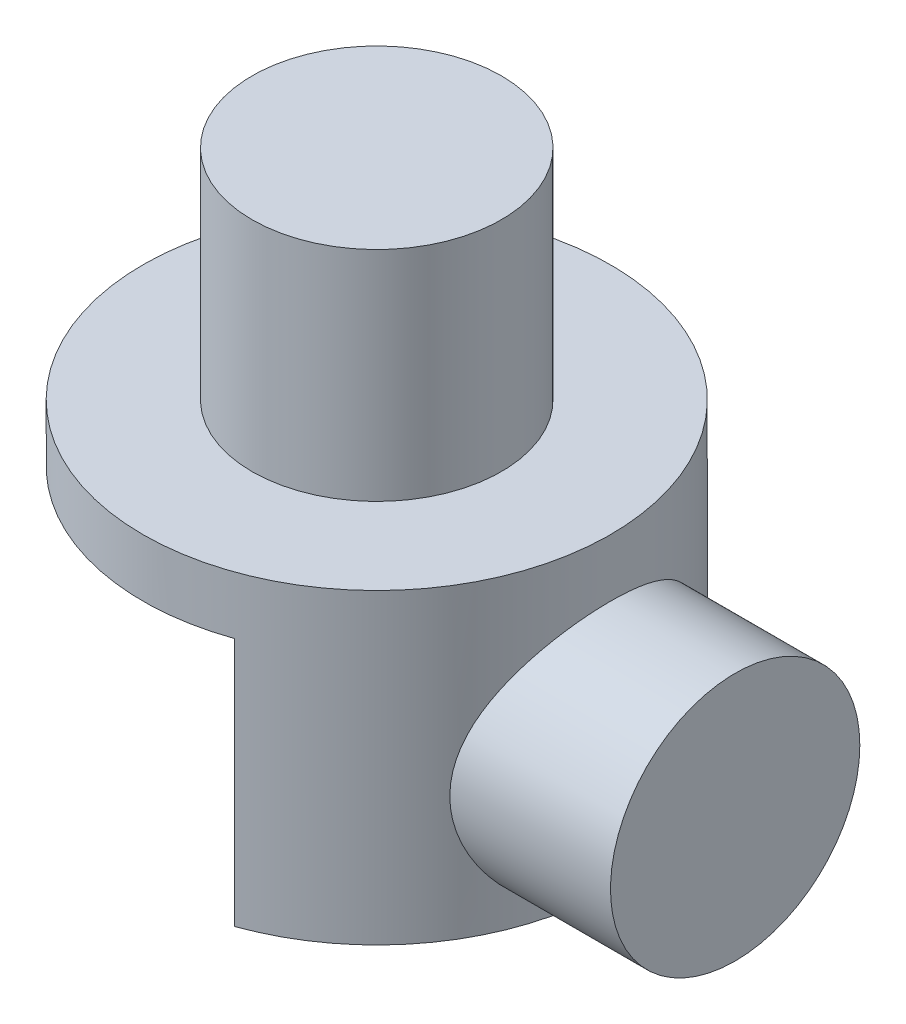
ISO-10303-21;
HEADER;
FILE_DESCRIPTION(('STEP AP214'),'2;1');
FILE_NAME('part.step','',(''),(''),'','','');
FILE_SCHEMA(('AUTOMOTIVE_DESIGN { 1 0 10303 214 1 1 1 1 }'));
ENDSEC;
DATA;
#1=APPLICATION_CONTEXT('core data for automotive mechanical design processes');
#2=APPLICATION_PROTOCOL_DEFINITION('international standard','automotive_design',2000,#1);
#3=PRODUCT_CONTEXT('',#1,'mechanical');
#4=PRODUCT('Part','Part','',(#3));
#5=PRODUCT_RELATED_PRODUCT_CATEGORY('part','',(#4));
#6=PRODUCT_DEFINITION_FORMATION('','',#4);
#7=PRODUCT_DEFINITION_CONTEXT('part definition',#1,'design');
#8=PRODUCT_DEFINITION('design','',#6,#7);
#9=PRODUCT_DEFINITION_SHAPE('','',#8);
#10=(LENGTH_UNIT() NAMED_UNIT(*) SI_UNIT(.MILLI.,.METRE.));
#11=(NAMED_UNIT(*) PLANE_ANGLE_UNIT() SI_UNIT($,.RADIAN.));
#12=(NAMED_UNIT(*) SI_UNIT($,.STERADIAN.) SOLID_ANGLE_UNIT());
#13=UNCERTAINTY_MEASURE_WITH_UNIT(LENGTH_MEASURE(1.E-05),#10,'distance_accuracy_value','');
#14=(GEOMETRIC_REPRESENTATION_CONTEXT(3) GLOBAL_UNCERTAINTY_ASSIGNED_CONTEXT((#13)) GLOBAL_UNIT_ASSIGNED_CONTEXT((#10,
#11,#12)) REPRESENTATION_CONTEXT('',''));
#15=CARTESIAN_POINT('',(0.,0.,0.));
#16=DIRECTION('',(0.,0.,1.));
#17=DIRECTION('',(1.,0.,0.));
#18=AXIS2_PLACEMENT_3D('',#15,#16,#17);
#19=CARTESIAN_POINT('',(0.,1.85,0.));
#20=DIRECTION('',(0.,-1.,0.));
#21=DIRECTION('',(0.,0.,-1.));
#22=AXIS2_PLACEMENT_3D('',#19,#20,#21);
#23=CYLINDRICAL_SURFACE('',#22,7.5);
#24=CARTESIAN_POINT('',(0.,1.85,0.));
#25=DIRECTION('',(0.,1.,0.));
#26=DIRECTION('',(0.,0.,1.));
#27=AXIS2_PLACEMENT_3D('',#24,#25,#26);
#28=CIRCLE('',#27,7.5);
#29=CARTESIAN_POINT('',(0.,1.85,7.5));
#30=VERTEX_POINT('',#29);
#31=EDGE_CURVE('E55',#30,#30,#28,.T.);
#32=ORIENTED_EDGE('',*,*,#31,.F.);
#33=EDGE_LOOP('',(#32));
#34=FACE_BOUND('',#33,.T.);
#35=CARTESIAN_POINT('',(0.,-8.,0.));
#36=DIRECTION('',(0.,-1.,0.));
#37=DIRECTION('',(0.,0.,1.));
#38=AXIS2_PLACEMENT_3D('',#35,#36,#37);
#39=CIRCLE('',#38,7.5);
#40=CARTESIAN_POINT('',(7.5,-8.,0.));
#41=VERTEX_POINT('',#40);
#42=CARTESIAN_POINT('',(2.5,-8.,7.07106781186548));
#43=VERTEX_POINT('',#42);
#44=EDGE_CURVE('E79',#41,#43,#39,.T.);
#45=ORIENTED_EDGE('',*,*,#44,.F.);
#46=CARTESIAN_POINT('',(6.34428877022476,-4.,4.));
#47=CARTESIAN_POINT('',(6.34428830362426,-3.89685951872148,4.00000036116636));
#48=CARTESIAN_POINT('',(6.34681238212198,-3.79372350453203,3.99600566671391));
#49=CARTESIAN_POINT('',(6.35680645313978,-3.58827042299068,3.98008789445433));
#50=CARTESIAN_POINT('',(6.36427830575549,-3.4859536782868,3.96816183487534));
#51=CARTESIAN_POINT('',(6.38389222030966,-3.28284699805151,3.93652969843417));
#52=CARTESIAN_POINT('',(6.39604041069842,-3.18205924722045,3.91681341139617));
#53=CARTESIAN_POINT('',(6.42455191828165,-2.9828419323026,3.86986831662271));
#54=CARTESIAN_POINT('',(6.44091710055245,-2.88441343276474,3.84263618442603));
#55=CARTESIAN_POINT('',(6.49528574194397,-2.59485891509227,3.75051454042651));
#56=CARTESIAN_POINT('',(6.5387143493523,-2.408025203624,3.67496986448624));
#57=CARTESIAN_POINT('',(6.63499735625147,-2.04984547172326,3.49812708733381));
#58=CARTESIAN_POINT('',(6.68785328350142,-1.87850196837275,3.39682481079913));
#59=CARTESIAN_POINT('',(6.80312517186403,-1.5381904906397,3.16012884998962));
#60=CARTESIAN_POINT('',(6.86597249499653,-1.37098070338328,3.02241665379624));
#61=CARTESIAN_POINT('',(6.99070595872307,-1.06057806244482,2.72148987282557));
#62=CARTESIAN_POINT('',(7.05259154158691,-0.917398705029578,2.55826105581742));
#63=CARTESIAN_POINT('',(7.1426455092021,-0.718041721719041,2.28965803204294));
#64=CARTESIAN_POINT('',(7.17323616741983,-0.652125892452859,2.1921806827501));
#65=CARTESIAN_POINT('',(7.23160286993109,-0.528828156182322,1.99119263621684));
#66=CARTESIAN_POINT('',(7.2593801268176,-0.471442567562584,1.88768456881552));
#67=CARTESIAN_POINT('',(7.31132412928514,-0.365777070144316,1.67526048930677));
#68=CARTESIAN_POINT('',(7.3354911070001,-0.317496575853515,1.56634482549775));
#69=CARTESIAN_POINT('',(7.37947845424356,-0.230635927573173,1.34392506317859));
#70=CARTESIAN_POINT('',(7.39930140012975,-0.192050021918153,1.2304237319053));
#71=CARTESIAN_POINT('',(7.43262328863746,-0.127715914303937,1.00879348258243));
#72=CARTESIAN_POINT('',(7.44649710047808,-0.101196485373028,0.900944542404754));
#73=CARTESIAN_POINT('',(7.46964064976823,-0.0571732387668518,0.682985576818887));
#74=CARTESIAN_POINT('',(7.47891273499633,-0.0396648235470625,0.572876734325223));
#75=CARTESIAN_POINT('',(7.49258884597767,-0.0138982654344577,0.351320443482026));
#76=CARTESIAN_POINT('',(7.49699462428509,-0.00563679232904127,0.239873491666579));
#77=CARTESIAN_POINT('',(7.50081261479417,0.00152460923567981,0.0165987671156426));
#78=CARTESIAN_POINT('',(7.50022519020419,0.000425218609371757,-0.0952289773292834));
#79=CARTESIAN_POINT('',(7.49437902818909,-0.0105468757448968,-0.307221674685573));
#80=CARTESIAN_POINT('',(7.48958821645741,-0.0195407940112967,-0.40744585813265));
#81=CARTESIAN_POINT('',(7.47609058444024,-0.0449981628660848,-0.606683346511145));
#82=CARTESIAN_POINT('',(7.46738251868692,-0.0614639891182039,-0.705696256032612));
#83=CARTESIAN_POINT('',(7.43566388753626,-0.121814044548408,-0.999812619515286));
#84=CARTESIAN_POINT('',(7.40705283232187,-0.17666156951274,-1.1921926813063));
#85=CARTESIAN_POINT('',(7.33703480697238,-0.314136065870602,-1.56677227675135));
#86=CARTESIAN_POINT('',(7.29547849592566,-0.397088295730491,-1.74882205139958));
#87=CARTESIAN_POINT('',(7.20317443640815,-0.587860966652318,-2.09683305038025));
#88=CARTESIAN_POINT('',(7.15242360495951,-0.695689752298495,-2.26278884956334));
#89=CARTESIAN_POINT('',(7.04014494842088,-0.945920271906222,-2.59223860409952));
#90=CARTESIAN_POINT('',(6.97804534234028,-1.09074602715711,-2.75369756251597));
#91=CARTESIAN_POINT('',(6.85319448303079,-1.40442017474105,-3.05119735766159));
#92=CARTESIAN_POINT('',(6.79044266923494,-1.57329114877496,-3.18721401963542));
#93=CARTESIAN_POINT('',(6.6658002716699,-1.94668312694474,-3.44073017105825));
#94=CARTESIAN_POINT('',(6.60437206928146,-2.15296880129814,-3.55590786815166));
#95=CARTESIAN_POINT('',(6.52360492320023,-2.47736189406762,-3.70076234562952));
#96=CARTESIAN_POINT('',(6.49857494178283,-2.58800815202909,-3.74440046743027));
#97=CARTESIAN_POINT('',(6.45332075092818,-2.81360733731007,-3.82186664196563));
#98=CARTESIAN_POINT('',(6.43309338587968,-2.9285573789703,-3.85570113951701));
#99=CARTESIAN_POINT('',(6.39977370683186,-3.15244200425189,-3.91073492926686));
#100=CARTESIAN_POINT('',(6.38623776881821,-3.26111486054406,-3.93273271256195));
#101=CARTESIAN_POINT('',(6.36459759042033,-3.48039304208916,-3.96765953407161));
#102=CARTESIAN_POINT('',(6.3564903185014,-3.59099725334404,-3.98059363391483));
#103=CARTESIAN_POINT('',(6.34607201023125,-3.81310869542557,-3.99718238972551));
#104=CARTESIAN_POINT('',(6.3437576116751,-3.92461536473833,-4.00084242840728));
#105=CARTESIAN_POINT('',(6.34502488319353,-4.14750391699368,-3.99883249058122));
#106=CARTESIAN_POINT('',(6.34860600613062,-4.2588858105562,-3.99316337987084));
#107=CARTESIAN_POINT('',(6.36063535771052,-4.46570424420917,-3.97396833938438));
#108=CARTESIAN_POINT('',(6.3683727655776,-4.56129093107725,-3.96158788758346));
#109=CARTESIAN_POINT('',(6.3878781302586,-4.75093501203188,-3.93005725662692));
#110=CARTESIAN_POINT('',(6.39964739083981,-4.84499190111437,-3.91090488759367));
#111=CARTESIAN_POINT('',(6.44046230133925,-5.1239552145897,-3.84359837630776));
#112=CARTESIAN_POINT('',(6.47502296219509,-5.30577685355066,-3.78558312282822));
#113=CARTESIAN_POINT('',(6.55667740487937,-5.66496121960721,-3.64239055541202));
#114=CARTESIAN_POINT('',(6.60425843359295,-5.84176990951326,-3.55612415468074));
#115=CARTESIAN_POINT('',(6.70628228186569,-6.17948538586243,-3.35976377508047));
#116=CARTESIAN_POINT('',(6.76072858645555,-6.3403840213198,-3.24965767392532));
#117=CARTESIAN_POINT('',(6.87995159117055,-6.66647114366188,-2.98991165583786));
#118=CARTESIAN_POINT('',(6.94506930981437,-6.82880566376881,-2.83683827022625));
#119=CARTESIAN_POINT('',(7.07159638356237,-7.12660507948739,-2.50479844607497));
#120=CARTESIAN_POINT('',(7.13300388785642,-7.26205664048507,-2.32581923333881));
#121=CARTESIAN_POINT('',(7.21889091401179,-7.44461965909848,-2.03675011028394));
#122=CARTESIAN_POINT('',(7.24697909441272,-7.50298595168534,-1.93468262511181));
#123=CARTESIAN_POINT('',(7.29970230500419,-7.61079923832939,-1.72510702546368));
#124=CARTESIAN_POINT('',(7.32433887638641,-7.66025021604666,-1.61760136858092));
#125=CARTESIAN_POINT('',(7.36942043387466,-7.7496460482734,-1.39793131432606));
#126=CARTESIAN_POINT('',(7.38986774386555,-7.78959617512333,-1.28576954157147));
#127=CARTESIAN_POINT('',(7.4259525788968,-7.85949081848084,-1.05761863930131));
#128=CARTESIAN_POINT('',(7.44159076980466,-7.88943672021652,-0.941630042110101));
#129=CARTESIAN_POINT('',(7.46626527615078,-7.93642915286948,-0.718479385496121));
#130=CARTESIAN_POINT('',(7.47580150064651,-7.95445841307083,-0.61157866507185));
#131=CARTESIAN_POINT('',(7.4902952781013,-7.98179087677527,-0.396363401728571));
#132=CARTESIAN_POINT('',(7.49525326997752,-7.99109491677038,-0.288048995350164));
#133=CARTESIAN_POINT('',(7.50045011269125,-8.00084602020049,-0.0709496977707435));
#134=CARTESIAN_POINT('',(7.50069072002406,-8.00129638026054,0.0378350032268166));
#135=CARTESIAN_POINT('',(7.49645091765879,-7.99334290495608,0.254983539993163));
#136=CARTESIAN_POINT('',(7.49197070372063,-7.98493943673632,0.363347393026381));
#137=CARTESIAN_POINT('',(7.47896770397045,-7.96043642611968,0.569969664686811));
#138=CARTESIAN_POINT('',(7.47080392206953,-7.94501950547003,0.668332251528444));
#139=CARTESIAN_POINT('',(7.4507958094526,-7.90699542978355,0.863288284569643));
#140=CARTESIAN_POINT('',(7.43895023770947,-7.88438585024454,0.959881122594105));
#141=CARTESIAN_POINT('',(7.39827359558509,-7.80611193212975,1.24600292657858));
#142=CARTESIAN_POINT('',(7.36429057683286,-7.73998061007891,1.43205516416645));
#143=CARTESIAN_POINT('',(7.28399359713269,-7.57932500296447,1.79715929684814));
#144=CARTESIAN_POINT('',(7.23726296225867,-7.48382406224658,1.97568263573005));
#145=CARTESIAN_POINT('',(7.13602243663058,-7.26831138818109,2.31484960015309));
#146=CARTESIAN_POINT('',(7.08150919609352,-7.14828909073147,2.47548547331529));
#147=CARTESIAN_POINT('',(6.96281363696927,-6.8719419070671,2.7930353263964));
#148=CARTESIAN_POINT('',(6.89822811260871,-6.71307271195496,2.94758313347103));
#149=CARTESIAN_POINT('',(6.77108894760047,-6.371239313496,3.2289669684827));
#150=CARTESIAN_POINT('',(6.70853761533614,-6.18824885071136,3.35577238888021));
#151=CARTESIAN_POINT('',(6.62001185715181,-5.89314871300886,3.52559711201028));
#152=CARTESIAN_POINT('',(6.59071626187825,-5.78838552012427,3.57990094169338));
#153=CARTESIAN_POINT('',(6.53573201316813,-5.57370376011021,3.6793246154066));
#154=CARTESIAN_POINT('',(6.51004151317234,-5.46378787100805,3.72444916650299));
#155=CARTESIAN_POINT('',(6.46336317125682,-5.23977074627022,3.80487821921116));
#156=CARTESIAN_POINT('',(6.44236369062886,-5.12568070511353,3.84020707833288));
#157=CARTESIAN_POINT('',(6.40595027692141,-4.89401526635369,3.90064740933781));
#158=CARTESIAN_POINT('',(6.3905326486664,-4.77644223046983,3.92576564199373));
#159=CARTESIAN_POINT('',(6.3671234670712,-4.54941548589387,3.96360790373709));
#160=CARTESIAN_POINT('',(6.35859431823577,-4.44016717470602,3.97723402104058));
#161=CARTESIAN_POINT('',(6.34717711302549,-4.22061089917834,3.99543004668397));
#162=CARTESIAN_POINT('',(6.34428926922753,-4.11030289506432,3.99999961375306));
#163=CARTESIAN_POINT('',(6.34428877022476,-4.,4.));
#164=B_SPLINE_CURVE_WITH_KNOTS('',3,(#46,#47,#48,#49,#50,#51,#52,#53,#54,#55,#56,#57,#58,#59,
#60,#61,#62,#63,#64,#65,#66,#67,#68,#69,#70,#71,#72,#73,#74,#75,#76,#77,#78,#79,#80,#81,#82,#83,
#84,#85,#86,#87,#88,#89,#90,#91,#92,#93,#94,#95,#96,#97,#98,#99,#100,#101,#102,#103,#104,#105,
#106,#107,#108,#109,#110,#111,#112,#113,#114,#115,#116,#117,#118,#119,#120,#121,#122,#123,#124,
#125,#126,#127,#128,#129,#130,#131,#132,#133,#134,#135,#136,#137,#138,#139,#140,#141,#142,#143,
#144,#145,#146,#147,#148,#149,#150,#151,#152,#153,#154,#155,#156,#157,#158,#159,#160,#161,#162,
#163),.UNSPECIFIED.,.T.,.F.,(4,2,2,2,2,2,2,2,2,2,2,2,2,2,2,2,2,2,2,2,2,2,2,2,2,2,2,2,2,2,2,2,2,
2,2,2,2,2,2,2,2,2,2,2,2,2,2,2,2,2,2,2,2,2,2,2,2,2,4),(0.,0.309306204825012,0.618728758131652,
0.928558205127848,1.23852491830298,1.85411962519086,2.46981418403881,3.14375489314467,
3.81807285164523,4.1824182477439,4.54660593448523,4.91077019457903,5.27471788813706,
5.61002887914114,5.94516861979006,6.28018762365405,6.61518225825926,6.91703282952155,
7.21897944030129,7.82228215440135,8.432820013441,9.04356296965468,9.71755822368036,
10.3921906768572,11.1202885142929,11.4844677350536,11.8484070015715,12.183018103439,
12.5174421919586,12.8516721344558,13.1858710602867,13.475612959308,13.7654486398168,
14.3447543158346,14.9497143388836,15.5549827044776,16.2493340258668,16.9440289066359,
17.3062683747878,17.6683455789124,18.0302213829458,18.3920470593086,18.7180939505302,
19.0441095802476,19.3700038173173,19.6958845409501,19.9952213077199,20.294659082061,
20.892996105862,21.5138963849688,22.1350647217444,22.8247691404035,23.5152306991858,
23.8795582077274,24.2436984182234,24.6069248844619,24.9699104538959,25.3006834334837,
25.6314688770908),.UNSPECIFIED.);
#165=EDGE_CURVE('E61',#41,#41,#164,.T.);
#166=ORIENTED_EDGE('',*,*,#165,.T.);
#167=CARTESIAN_POINT('',(2.5,-8.,-7.07106781186548));
#168=VERTEX_POINT('',#167);
#169=EDGE_CURVE('E85',#168,#41,#39,.T.);
#170=ORIENTED_EDGE('',*,*,#169,.F.);
#171=DIRECTION('',(0.,1.,0.));
#172=VECTOR('',#171,1.);
#173=CARTESIAN_POINT('',(2.5,-8.,-7.07106781186548));
#174=LINE('',#173,#172);
#175=CARTESIAN_POINT('',(2.5,0.,-7.07106781186548));
#176=VERTEX_POINT('',#175);
#177=EDGE_CURVE('E96',#168,#176,#174,.T.);
#178=ORIENTED_EDGE('',*,*,#177,.T.);
#179=CARTESIAN_POINT('',(0.,0.,0.));
#180=DIRECTION('',(0.,1.,0.));
#181=DIRECTION('',(0.,0.,1.));
#182=AXIS2_PLACEMENT_3D('',#179,#180,#181);
#183=CIRCLE('',#182,7.5);
#184=CARTESIAN_POINT('',(2.5,0.,7.07106781186548));
#185=VERTEX_POINT('',#184);
#186=EDGE_CURVE('E99',#176,#185,#183,.T.);
#187=ORIENTED_EDGE('',*,*,#186,.T.);
#188=DIRECTION('',(0.,1.,0.));
#189=VECTOR('',#188,1.);
#190=CARTESIAN_POINT('',(2.5,-8.,7.07106781186548));
#191=LINE('',#190,#189);
#192=EDGE_CURVE('E94',#43,#185,#191,.T.);
#193=ORIENTED_EDGE('',*,*,#192,.F.);
#194=EDGE_LOOP('',(#45,#166,#170,#178,#187,#193));
#195=FACE_BOUND('',#194,.T.);
#196=ADVANCED_FACE('F45',(#34,#195),#23,.T.);
#197=CARTESIAN_POINT('',(0.,0.,0.));
#198=DIRECTION('',(0.,1.,0.));
#199=DIRECTION('',(0.,0.,1.));
#200=AXIS2_PLACEMENT_3D('',#197,#198,#199);
#201=PLANE('',#200);
#202=DIRECTION('',(0.,0.,-1.));
#203=VECTOR('',#202,1.);
#204=CARTESIAN_POINT('',(2.5,0.,7.07106781186548));
#205=LINE('',#204,#203);
#206=EDGE_CURVE('E67',#185,#176,#205,.T.);
#207=ORIENTED_EDGE('',*,*,#206,.F.);
#208=ORIENTED_EDGE('',*,*,#186,.F.);
#209=EDGE_LOOP('',(#207,#208));
#210=FACE_BOUND('',#209,.T.);
#211=ADVANCED_FACE('F114',(#210),#201,.F.);
#212=CARTESIAN_POINT('',(0.,1.85,0.));
#213=DIRECTION('',(0.,1.,0.));
#214=DIRECTION('',(0.,0.,1.));
#215=AXIS2_PLACEMENT_3D('',#212,#213,#214);
#216=PLANE('',#215);
#217=CARTESIAN_POINT('',(0.,1.85,0.));
#218=DIRECTION('',(0.,1.,0.));
#219=DIRECTION('',(0.,0.,1.));
#220=AXIS2_PLACEMENT_3D('',#217,#218,#219);
#221=CIRCLE('',#220,4.);
#222=CARTESIAN_POINT('',(0.,1.85,4.));
#223=VERTEX_POINT('',#222);
#224=EDGE_CURVE('E11',#223,#223,#221,.T.);
#225=ORIENTED_EDGE('',*,*,#224,.F.);
#226=EDGE_LOOP('',(#225));
#227=FACE_BOUND('',#226,.T.);
#228=ORIENTED_EDGE('',*,*,#31,.T.);
#229=EDGE_LOOP('',(#228));
#230=FACE_BOUND('',#229,.T.);
#231=ADVANCED_FACE('F111',(#227,#230),#216,.T.);
#232=CARTESIAN_POINT('',(2.5,-8.,7.07106781186548));
#233=DIRECTION('',(1.,0.,0.));
#234=DIRECTION('',(0.,0.,-1.));
#235=AXIS2_PLACEMENT_3D('',#232,#233,#234);
#236=PLANE('',#235);
#237=ORIENTED_EDGE('',*,*,#177,.F.);
#238=DIRECTION('',(0.,0.,-1.));
#239=VECTOR('',#238,1.);
#240=CARTESIAN_POINT('',(2.5,-8.,7.07106781186548));
#241=LINE('',#240,#239);
#242=EDGE_CURVE('E82',#43,#168,#241,.T.);
#243=ORIENTED_EDGE('',*,*,#242,.F.);
#244=ORIENTED_EDGE('',*,*,#192,.T.);
#245=ORIENTED_EDGE('',*,*,#206,.T.);
#246=EDGE_LOOP('',(#237,#243,#244,#245));
#247=FACE_BOUND('',#246,.T.);
#248=CARTESIAN_POINT('',(2.5,-4.,0.));
#249=DIRECTION('',(1.,0.,0.));
#250=DIRECTION('',(0.,0.,-1.));
#251=AXIS2_PLACEMENT_3D('',#248,#249,#250);
#252=CIRCLE('',#251,3.5);
#253=CARTESIAN_POINT('',(2.5,-4.,3.5));
#254=VERTEX_POINT('',#253);
#255=EDGE_CURVE('E49',#254,#254,#252,.F.);
#256=ORIENTED_EDGE('',*,*,#255,.F.);
#257=EDGE_LOOP('',(#256));
#258=FACE_BOUND('',#257,.T.);
#259=ADVANCED_FACE('F92',(#247,#258),#236,.F.);
#260=CARTESIAN_POINT('',(0.,-8.,0.));
#261=DIRECTION('',(0.,1.,0.));
#262=DIRECTION('',(0.,0.,1.));
#263=AXIS2_PLACEMENT_3D('',#260,#261,#262);
#264=PLANE('',#263);
#265=ORIENTED_EDGE('',*,*,#169,.T.);
#266=ORIENTED_EDGE('',*,*,#44,.T.);
#267=ORIENTED_EDGE('',*,*,#242,.T.);
#268=EDGE_LOOP('',(#265,#266,#267));
#269=FACE_BOUND('',#268,.T.);
#270=ADVANCED_FACE('F81',(#269),#264,.F.);
#271=CARTESIAN_POINT('',(7.5,-4.,0.));
#272=DIRECTION('',(-1.,0.,0.));
#273=DIRECTION('',(0.,0.,1.));
#274=AXIS2_PLACEMENT_3D('',#271,#272,#273);
#275=CYLINDRICAL_SURFACE('',#274,3.5);
#276=CARTESIAN_POINT('',(9.5,-4.,0.));
#277=DIRECTION('',(-1.,0.,0.));
#278=DIRECTION('',(0.,0.,1.));
#279=AXIS2_PLACEMENT_3D('',#276,#277,#278);
#280=CIRCLE('',#279,3.5);
#281=CARTESIAN_POINT('',(9.5,-4.,3.5));
#282=VERTEX_POINT('',#281);
#283=EDGE_CURVE('E144',#282,#282,#280,.T.);
#284=CARTESIAN_POINT('',(2.5,-4.,3.5));
#285=CARTESIAN_POINT('',(2.57291666666667,-4.,3.5));
#286=CARTESIAN_POINT('',(2.64583333333333,-4.,3.5));
#287=CARTESIAN_POINT('',(2.79166666666667,-4.,3.5));
#288=CARTESIAN_POINT('',(2.86458333333333,-4.,3.5));
#289=CARTESIAN_POINT('',(3.01041666666667,-4.,3.5));
#290=CARTESIAN_POINT('',(3.08333333333333,-4.,3.5));
#291=CARTESIAN_POINT('',(3.22916666666667,-4.,3.5));
#292=CARTESIAN_POINT('',(3.30208333333333,-4.,3.5));
#293=CARTESIAN_POINT('',(3.44791666666667,-4.,3.5));
#294=CARTESIAN_POINT('',(3.52083333333333,-4.,3.5));
#295=CARTESIAN_POINT('',(3.66666666666667,-4.,3.5));
#296=CARTESIAN_POINT('',(3.73958333333333,-4.,3.5));
#297=CARTESIAN_POINT('',(3.88541666666667,-4.,3.5));
#298=CARTESIAN_POINT('',(3.95833333333333,-4.,3.5));
#299=CARTESIAN_POINT('',(4.10416666666667,-4.,3.5));
#300=CARTESIAN_POINT('',(4.17708333333333,-4.,3.5));
#301=CARTESIAN_POINT('',(4.32291666666667,-4.,3.5));
#302=CARTESIAN_POINT('',(4.39583333333333,-4.,3.5));
#303=CARTESIAN_POINT('',(4.54166666666667,-4.,3.5));
#304=CARTESIAN_POINT('',(4.61458333333333,-4.,3.5));
#305=CARTESIAN_POINT('',(4.76041666666667,-4.,3.5));
#306=CARTESIAN_POINT('',(4.83333333333333,-4.,3.5));
#307=CARTESIAN_POINT('',(4.97916666666667,-4.,3.5));
#308=CARTESIAN_POINT('',(5.05208333333333,-4.,3.5));
#309=CARTESIAN_POINT('',(5.19791666666667,-4.,3.5));
#310=CARTESIAN_POINT('',(5.27083333333333,-4.,3.5));
#311=CARTESIAN_POINT('',(5.41666666666667,-4.,3.5));
#312=CARTESIAN_POINT('',(5.48958333333333,-4.,3.5));
#313=CARTESIAN_POINT('',(5.63541666666667,-4.,3.5));
#314=CARTESIAN_POINT('',(5.70833333333333,-4.,3.5));
#315=CARTESIAN_POINT('',(5.85416666666667,-4.,3.5));
#316=CARTESIAN_POINT('',(5.92708333333334,-4.,3.5));
#317=CARTESIAN_POINT('',(6.07291666666667,-4.,3.5));
#318=CARTESIAN_POINT('',(6.14583333333334,-4.,3.5));
#319=CARTESIAN_POINT('',(6.29166666666667,-4.,3.5));
#320=CARTESIAN_POINT('',(6.36458333333333,-4.,3.5));
#321=CARTESIAN_POINT('',(6.51041666666667,-4.,3.5));
#322=CARTESIAN_POINT('',(6.58333333333333,-4.,3.5));
#323=CARTESIAN_POINT('',(6.72916666666667,-4.,3.5));
#324=CARTESIAN_POINT('',(6.80208333333334,-4.,3.5));
#325=CARTESIAN_POINT('',(6.94791666666667,-4.,3.5));
#326=CARTESIAN_POINT('',(7.02083333333334,-4.,3.5));
#327=CARTESIAN_POINT('',(7.16666666666667,-4.,3.5));
#328=CARTESIAN_POINT('',(7.23958333333334,-4.,3.5));
#329=CARTESIAN_POINT('',(7.38541666666667,-4.,3.5));
#330=CARTESIAN_POINT('',(7.45833333333334,-4.,3.5));
#331=CARTESIAN_POINT('',(7.60416666666667,-4.,3.5));
#332=CARTESIAN_POINT('',(7.67708333333334,-4.,3.5));
#333=CARTESIAN_POINT('',(7.82291666666667,-4.,3.5));
#334=CARTESIAN_POINT('',(7.89583333333333,-4.,3.5));
#335=CARTESIAN_POINT('',(8.04166666666667,-4.,3.5));
#336=CARTESIAN_POINT('',(8.11458333333333,-4.,3.5));
#337=CARTESIAN_POINT('',(8.26041666666667,-4.,3.5));
#338=CARTESIAN_POINT('',(8.33333333333334,-4.,3.5));
#339=CARTESIAN_POINT('',(8.47916666666667,-4.,3.5));
#340=CARTESIAN_POINT('',(8.55208333333334,-4.,3.5));
#341=CARTESIAN_POINT('',(8.69791666666667,-4.,3.5));
#342=CARTESIAN_POINT('',(8.77083333333334,-4.,3.5));
#343=CARTESIAN_POINT('',(8.91666666666667,-4.,3.5));
#344=CARTESIAN_POINT('',(8.98958333333334,-4.,3.5));
#345=CARTESIAN_POINT('',(9.13541666666667,-4.,3.5));
#346=CARTESIAN_POINT('',(9.20833333333334,-4.,3.5));
#347=CARTESIAN_POINT('',(9.35416666666667,-4.,3.5));
#348=CARTESIAN_POINT('',(9.42708333333334,-4.,3.5));
#349=CARTESIAN_POINT('',(9.5,-4.,3.5));
#350=B_SPLINE_CURVE_WITH_KNOTS('',3,(#284,#285,#286,#287,#288,#289,#290,#291,#292,#293,#294,
#295,#296,#297,#298,#299,#300,#301,#302,#303,#304,#305,#306,#307,#308,#309,#310,#311,#312,#313,
#314,#315,#316,#317,#318,#319,#320,#321,#322,#323,#324,#325,#326,#327,#328,#329,#330,#331,#332,
#333,#334,#335,#336,#337,#338,#339,#340,#341,#342,#343,#344,#345,#346,#347,#348,#349),
.UNSPECIFIED.,.F.,.F.,(4,2,2,2,2,2,2,2,2,2,2,2,2,2,2,2,2,2,2,2,2,2,2,2,2,2,2,2,2,2,2,2,4),(0.,
0.21875,0.4375,0.656250000000001,0.875000000000001,1.09375,1.3125,1.53125,1.75,1.96875,2.1875,
2.40625,2.625,2.84375,3.0625,3.28125,3.5,3.71875,3.9375,4.15625,4.375,4.59375,4.8125,5.03125,
5.25,5.46875,5.6875,5.90625,6.125,6.34375,6.5625,6.78125,7.),.UNSPECIFIED.);
#351=EDGE_CURVE('BSEAM128',#254,#282,#350,.T.);
#352=ORIENTED_EDGE('',*,*,#255,.T.);
#353=ORIENTED_EDGE('',*,*,#283,.F.);
#354=ORIENTED_EDGE('',*,*,#351,.T.);
#355=ORIENTED_EDGE('',*,*,#351,.F.);
#356=EDGE_LOOP('',(#352,#354,#353,#355));
#357=FACE_BOUND('',#356,.T.);
#358=ADVANCED_FACE('F128',(#357),#275,.F.);
#359=CARTESIAN_POINT('',(9.5,-4.,0.));
#360=DIRECTION('',(-1.,0.,0.));
#361=DIRECTION('',(0.,0.,1.));
#362=AXIS2_PLACEMENT_3D('',#359,#360,#361);
#363=CYLINDRICAL_SURFACE('',#362,4.);
#364=ORIENTED_EDGE('',*,*,#165,.F.);
#365=EDGE_LOOP('',(#364));
#366=FACE_BOUND('',#365,.T.);
#367=CARTESIAN_POINT('',(11.5,-4.,0.));
#368=DIRECTION('',(1.,0.,0.));
#369=DIRECTION('',(0.,0.,-1.));
#370=AXIS2_PLACEMENT_3D('',#367,#368,#369);
#371=CIRCLE('',#370,4.);
#372=CARTESIAN_POINT('',(11.5,-4.,-4.));
#373=VERTEX_POINT('',#372);
#374=EDGE_CURVE('E158',#373,#373,#371,.T.);
#375=ORIENTED_EDGE('',*,*,#374,.F.);
#376=EDGE_LOOP('',(#375));
#377=FACE_BOUND('',#376,.T.);
#378=ADVANCED_FACE('F131',(#366,#377),#363,.T.);
#379=CARTESIAN_POINT('',(0.,8.85,0.));
#380=DIRECTION('',(0.,-1.,0.));
#381=DIRECTION('',(0.,0.,-1.));
#382=AXIS2_PLACEMENT_3D('',#379,#380,#381);
#383=CYLINDRICAL_SURFACE('',#382,4.);
#384=CARTESIAN_POINT('',(0.,8.85,0.));
#385=DIRECTION('',(0.,1.,0.));
#386=DIRECTION('',(0.,0.,1.));
#387=AXIS2_PLACEMENT_3D('',#384,#385,#386);
#388=CIRCLE('',#387,4.);
#389=CARTESIAN_POINT('',(0.,8.85,4.));
#390=VERTEX_POINT('',#389);
#391=EDGE_CURVE('E155',#390,#390,#388,.T.);
#392=ORIENTED_EDGE('',*,*,#391,.F.);
#393=EDGE_LOOP('',(#392));
#394=FACE_BOUND('',#393,.T.);
#395=ORIENTED_EDGE('',*,*,#224,.T.);
#396=EDGE_LOOP('',(#395));
#397=FACE_BOUND('',#396,.T.);
#398=ADVANCED_FACE('F136',(#394,#397),#383,.T.);
#399=CARTESIAN_POINT('',(0.,8.85,0.));
#400=DIRECTION('',(0.,1.,0.));
#401=DIRECTION('',(0.,0.,1.));
#402=AXIS2_PLACEMENT_3D('',#399,#400,#401);
#403=PLANE('',#402);
#404=ORIENTED_EDGE('',*,*,#391,.T.);
#405=EDGE_LOOP('',(#404));
#406=FACE_BOUND('',#405,.T.);
#407=ADVANCED_FACE('F175',(#406),#403,.T.);
#408=CARTESIAN_POINT('',(9.5,-4.,0.));
#409=DIRECTION('',(1.,0.,0.));
#410=DIRECTION('',(0.,0.,-1.));
#411=AXIS2_PLACEMENT_3D('',#408,#409,#410);
#412=PLANE('',#411);
#413=ORIENTED_EDGE('',*,*,#283,.T.);
#414=EDGE_LOOP('',(#413));
#415=FACE_BOUND('',#414,.T.);
#416=ADVANCED_FACE('F170',(#415),#412,.F.);
#417=CARTESIAN_POINT('',(11.5,-4.,0.));
#418=DIRECTION('',(1.,0.,0.));
#419=DIRECTION('',(0.,0.,-1.));
#420=AXIS2_PLACEMENT_3D('',#417,#418,#419);
#421=PLANE('',#420);
#422=ORIENTED_EDGE('',*,*,#374,.T.);
#423=EDGE_LOOP('',(#422));
#424=FACE_BOUND('',#423,.T.);
#425=ADVANCED_FACE('F167',(#424),#421,.T.);
#426=CLOSED_SHELL('',(#196,#211,#231,#259,#270,#358,#378,#398,#407,#416,#425));
#427=MANIFOLD_SOLID_BREP('B2',#426);
#428=ADVANCED_BREP_SHAPE_REPRESENTATION('',(#18,#427),#14);
#429=SHAPE_DEFINITION_REPRESENTATION(#9,#428);
ENDSEC;
END-ISO-10303-21;
